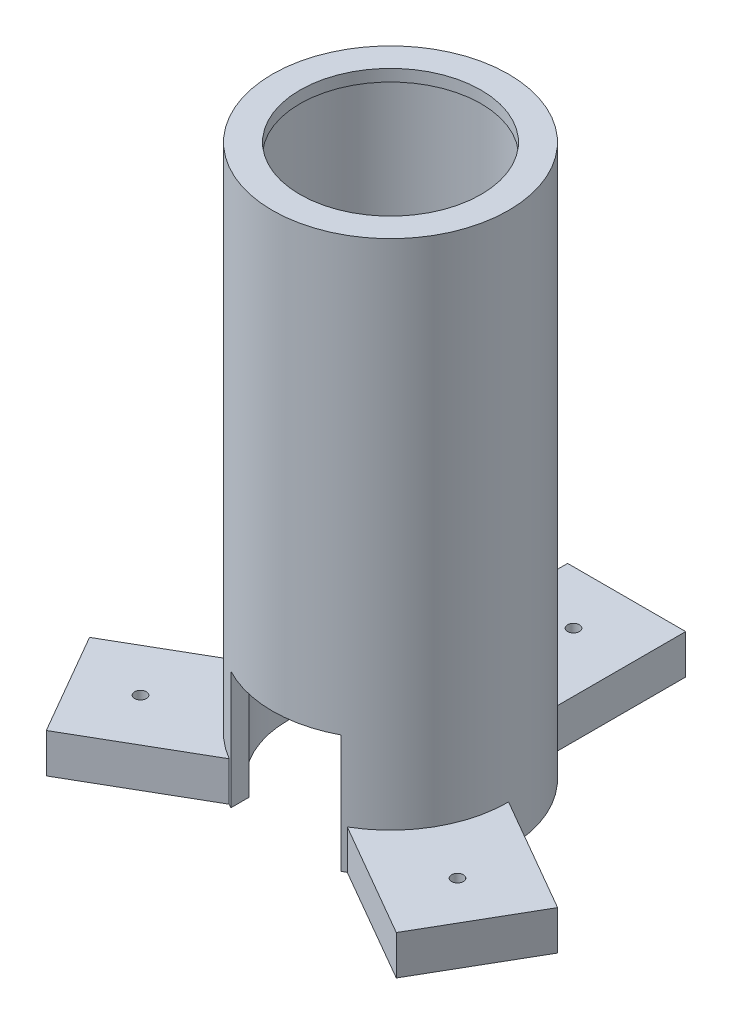
ISO-10303-21;
HEADER;
FILE_DESCRIPTION(('STEP AP214'),'2;1');
FILE_NAME('part.step','',(''),(''),'','','');
FILE_SCHEMA(('AUTOMOTIVE_DESIGN { 1 0 10303 214 1 1 1 1 }'));
ENDSEC;
DATA;
#1=APPLICATION_CONTEXT('core data for automotive mechanical design processes');
#2=APPLICATION_PROTOCOL_DEFINITION('international standard','automotive_design',2000,#1);
#3=PRODUCT_CONTEXT('',#1,'mechanical');
#4=PRODUCT('Part','Part','',(#3));
#5=PRODUCT_RELATED_PRODUCT_CATEGORY('part','',(#4));
#6=PRODUCT_DEFINITION_FORMATION('','',#4);
#7=PRODUCT_DEFINITION_CONTEXT('part definition',#1,'design');
#8=PRODUCT_DEFINITION('design','',#6,#7);
#9=PRODUCT_DEFINITION_SHAPE('','',#8);
#10=(LENGTH_UNIT() NAMED_UNIT(*) SI_UNIT(.MILLI.,.METRE.));
#11=(NAMED_UNIT(*) PLANE_ANGLE_UNIT() SI_UNIT($,.RADIAN.));
#12=(NAMED_UNIT(*) SI_UNIT($,.STERADIAN.) SOLID_ANGLE_UNIT());
#13=UNCERTAINTY_MEASURE_WITH_UNIT(LENGTH_MEASURE(1.E-05),#10,'distance_accuracy_value','');
#14=(GEOMETRIC_REPRESENTATION_CONTEXT(3) GLOBAL_UNCERTAINTY_ASSIGNED_CONTEXT((#13)) GLOBAL_UNIT_ASSIGNED_CONTEXT((#10,
#11,#12)) REPRESENTATION_CONTEXT('',''));
#15=CARTESIAN_POINT('',(0.,0.,0.));
#16=DIRECTION('',(0.,0.,1.));
#17=DIRECTION('',(1.,0.,0.));
#18=AXIS2_PLACEMENT_3D('',#15,#16,#17);
#19=CARTESIAN_POINT('',(0.,0.,0.));
#20=DIRECTION('',(0.,1.,0.));
#21=DIRECTION('',(0.,0.,1.));
#22=AXIS2_PLACEMENT_3D('',#19,#20,#21);
#23=PLANE('',#22);
#24=CARTESIAN_POINT('',(0.,0.,0.));
#25=DIRECTION('',(0.,1.,0.));
#26=DIRECTION('',(0.,0.,1.));
#27=AXIS2_PLACEMENT_3D('',#24,#25,#26);
#28=CIRCLE('',#27,13.);
#29=CARTESIAN_POINT('',(7.,0.,10.9544511501033));
#30=VERTEX_POINT('',#29);
#31=CARTESIAN_POINT('',(-7.,0.,10.9544511501033));
#32=VERTEX_POINT('',#31);
#33=EDGE_CURVE('E338',#30,#32,#28,.T.);
#34=ORIENTED_EDGE('',*,*,#33,.T.);
#35=DIRECTION('',(0.,0.,-1.));
#36=VECTOR('',#35,1.);
#37=CARTESIAN_POINT('',(-7.,0.,0.));
#38=LINE('',#37,#36);
#39=CARTESIAN_POINT('',(-7.,0.,13.2664991614216));
#40=VERTEX_POINT('',#39);
#41=EDGE_CURVE('E288',#40,#32,#38,.T.);
#42=ORIENTED_EDGE('',*,*,#41,.F.);
#43=CARTESIAN_POINT('',(0.,0.,0.));
#44=DIRECTION('',(0.,1.,0.));
#45=DIRECTION('',(0.,0.,1.));
#46=AXIS2_PLACEMENT_3D('',#43,#44,#45);
#47=CIRCLE('',#46,15.);
#48=CARTESIAN_POINT('',(-7.49999999999994,0.,12.9903810567666));
#49=VERTEX_POINT('',#48);
#50=EDGE_CURVE('E342',#49,#40,#47,.T.);
#51=ORIENTED_EDGE('',*,*,#50,.F.);
#52=DIRECTION('',(-0.866025403784436,0.,0.500000000000004));
#53=VECTOR('',#52,1.);
#54=CARTESIAN_POINT('',(-7.49999999999994,0.,12.9903810567666));
#55=LINE('',#54,#53);
#56=CARTESIAN_POINT('',(-22.2307621135331,0.,21.4951905283834));
#57=VERTEX_POINT('',#56);
#58=EDGE_CURVE('E229',#49,#57,#55,.T.);
#59=ORIENTED_EDGE('',*,*,#58,.T.);
#60=DIRECTION('',(-0.500000000000004,0.,-0.866025403784436));
#61=VECTOR('',#60,1.);
#62=CARTESIAN_POINT('',(-22.2307621135331,0.,21.4951905283834));
#63=LINE('',#62,#61);
#64=CARTESIAN_POINT('',(-29.7307621135331,0.,8.50480947161685));
#65=VERTEX_POINT('',#64);
#66=EDGE_CURVE('E214',#57,#65,#63,.T.);
#67=ORIENTED_EDGE('',*,*,#66,.T.);
#68=DIRECTION('',(0.866025403784437,0.,-0.500000000000004));
#69=VECTOR('',#68,1.);
#70=CARTESIAN_POINT('',(-15.,0.,0.));
#71=LINE('',#70,#69);
#72=CARTESIAN_POINT('',(-15.,0.,0.));
#73=VERTEX_POINT('',#72);
#74=EDGE_CURVE('E205',#65,#73,#71,.T.);
#75=ORIENTED_EDGE('',*,*,#74,.T.);
#76=CARTESIAN_POINT('',(-7.5,0.,-12.9903810567666));
#77=VERTEX_POINT('',#76);
#78=EDGE_CURVE('E348',#77,#73,#47,.T.);
#79=ORIENTED_EDGE('',*,*,#78,.F.);
#80=DIRECTION('',(0.,0.,-1.));
#81=VECTOR('',#80,1.);
#82=CARTESIAN_POINT('',(-7.5,0.,-12.9903810567666));
#83=LINE('',#82,#81);
#84=CARTESIAN_POINT('',(-7.5,0.,-30.));
#85=VERTEX_POINT('',#84);
#86=EDGE_CURVE('E278',#77,#85,#83,.T.);
#87=ORIENTED_EDGE('',*,*,#86,.T.);
#88=DIRECTION('',(1.,0.,0.));
#89=VECTOR('',#88,1.);
#90=CARTESIAN_POINT('',(-7.5,0.,-30.));
#91=LINE('',#90,#89);
#92=CARTESIAN_POINT('',(7.5,0.,-30.));
#93=VERTEX_POINT('',#92);
#94=EDGE_CURVE('E263',#85,#93,#91,.T.);
#95=ORIENTED_EDGE('',*,*,#94,.T.);
#96=DIRECTION('',(0.,0.,1.));
#97=VECTOR('',#96,1.);
#98=CARTESIAN_POINT('',(7.5,0.,-12.9903810567666));
#99=LINE('',#98,#97);
#100=CARTESIAN_POINT('',(7.5,0.,-12.9903810567666));
#101=VERTEX_POINT('',#100);
#102=EDGE_CURVE('E254',#93,#101,#99,.T.);
#103=ORIENTED_EDGE('',*,*,#102,.T.);
#104=CARTESIAN_POINT('',(15.,0.,-1.38777878078145E-13));
#105=VERTEX_POINT('',#104);
#106=EDGE_CURVE('E347',#105,#101,#47,.T.);
#107=ORIENTED_EDGE('',*,*,#106,.F.);
#108=DIRECTION('',(0.866025403784443,0.,0.499999999999992));
#109=VECTOR('',#108,1.);
#110=CARTESIAN_POINT('',(15.,0.,-1.38777878078145E-13));
#111=LINE('',#110,#109);
#112=CARTESIAN_POINT('',(29.7307621135332,0.,8.50480947161643));
#113=VERTEX_POINT('',#112);
#114=EDGE_CURVE('E190',#105,#113,#111,.T.);
#115=ORIENTED_EDGE('',*,*,#114,.T.);
#116=DIRECTION('',(-0.499999999999992,0.,0.866025403784443));
#117=VECTOR('',#116,1.);
#118=CARTESIAN_POINT('',(29.7307621135332,0.,8.50480947161643));
#119=LINE('',#118,#117);
#120=CARTESIAN_POINT('',(22.2307621135334,0.,21.4951905283831));
#121=VERTEX_POINT('',#120);
#122=EDGE_CURVE('E162',#113,#121,#119,.T.);
#123=ORIENTED_EDGE('',*,*,#122,.T.);
#124=DIRECTION('',(-0.866025403784443,0.,-0.499999999999992));
#125=VECTOR('',#124,1.);
#126=CARTESIAN_POINT('',(7.50000000000012,0.,12.9903810567665));
#127=LINE('',#126,#125);
#128=CARTESIAN_POINT('',(7.50000000000012,0.,12.9903810567665));
#129=VERTEX_POINT('',#128);
#130=EDGE_CURVE('E186',#121,#129,#127,.T.);
#131=ORIENTED_EDGE('',*,*,#130,.T.);
#132=CARTESIAN_POINT('',(7.,0.,13.2664991614216));
#133=VERTEX_POINT('',#132);
#134=EDGE_CURVE('E343',#133,#129,#47,.T.);
#135=ORIENTED_EDGE('',*,*,#134,.F.);
#136=DIRECTION('',(0.,0.,1.));
#137=VECTOR('',#136,1.);
#138=CARTESIAN_POINT('',(7.,0.,0.));
#139=LINE('',#138,#137);
#140=EDGE_CURVE('E303',#30,#133,#139,.T.);
#141=ORIENTED_EDGE('',*,*,#140,.F.);
#142=EDGE_LOOP('',(#34,#42,#51,#59,#67,#75,#79,#87,#95,#103,#107,#115,#123,#131,#135,#141));
#143=FACE_BOUND('',#142,.T.);
#144=CARTESIAN_POINT('',(0.,0.,-23.25));
#145=DIRECTION('',(0.,-1.,0.));
#146=DIRECTION('',(0.,0.,-1.));
#147=AXIS2_PLACEMENT_3D('',#144,#145,#146);
#148=CIRCLE('',#147,0.75);
#149=CARTESIAN_POINT('',(0.,0.,-24.));
#150=VERTEX_POINT('',#149);
#151=EDGE_CURVE('E239',#150,#150,#148,.T.);
#152=ORIENTED_EDGE('',*,*,#151,.F.);
#153=EDGE_LOOP('',(#152));
#154=FACE_BOUND('',#153,.T.);
#155=CARTESIAN_POINT('',(-20.1350906379881,0.,11.6250000000001));
#156=DIRECTION('',(0.,-1.,0.));
#157=DIRECTION('',(-0.866025403784436,0.,0.500000000000004));
#158=AXIS2_PLACEMENT_3D('',#155,#156,#157);
#159=CIRCLE('',#158,0.75);
#160=CARTESIAN_POINT('',(-20.7846096908265,0.,12.0000000000001));
#161=VERTEX_POINT('',#160);
#162=EDGE_CURVE('E197',#161,#161,#159,.T.);
#163=ORIENTED_EDGE('',*,*,#162,.F.);
#164=EDGE_LOOP('',(#163));
#165=FACE_BOUND('',#164,.T.);
#166=CARTESIAN_POINT('',(20.1350906379883,0.,11.6249999999998));
#167=DIRECTION('',(0.,-1.,0.));
#168=DIRECTION('',(0.866025403784443,0.,0.499999999999992));
#169=AXIS2_PLACEMENT_3D('',#166,#167,#168);
#170=CIRCLE('',#169,0.75);
#171=CARTESIAN_POINT('',(20.7846096908266,0.,11.9999999999998));
#172=VERTEX_POINT('',#171);
#173=EDGE_CURVE('E669',#172,#172,#170,.T.);
#174=ORIENTED_EDGE('',*,*,#173,.F.);
#175=EDGE_LOOP('',(#174));
#176=FACE_BOUND('',#175,.T.);
#177=ADVANCED_FACE('F43',(#143,#154,#165,#176),#23,.F.);
#178=CARTESIAN_POINT('',(0.,68.58,0.));
#179=DIRECTION('',(0.,-1.,0.));
#180=DIRECTION('',(0.,0.,-1.));
#181=AXIS2_PLACEMENT_3D('',#178,#179,#180);
#182=CYLINDRICAL_SURFACE('',#181,15.);
#183=ORIENTED_EDGE('',*,*,#134,.T.);
#184=DIRECTION('',(0.,-1.,0.));
#185=VECTOR('',#184,1.);
#186=CARTESIAN_POINT('',(7.50000000000013,5.,12.9903810567665));
#187=LINE('',#186,#185);
#188=CARTESIAN_POINT('',(7.50000000000012,5.,12.9903810567665));
#189=VERTEX_POINT('',#188);
#190=EDGE_CURVE('E59',#189,#129,#187,.T.);
#191=ORIENTED_EDGE('',*,*,#190,.F.);
#192=CARTESIAN_POINT('',(0.,5.,0.));
#193=DIRECTION('',(0.,1.,0.));
#194=DIRECTION('',(0.866025403784443,0.,0.499999999999992));
#195=AXIS2_PLACEMENT_3D('',#192,#193,#194);
#196=CIRCLE('',#195,15.);
#197=CARTESIAN_POINT('',(15.,5.,-1.38777878078145E-13));
#198=VERTEX_POINT('',#197);
#199=EDGE_CURVE('E63',#189,#198,#196,.T.);
#200=ORIENTED_EDGE('',*,*,#199,.T.);
#201=DIRECTION('',(0.,-1.,0.));
#202=VECTOR('',#201,1.);
#203=CARTESIAN_POINT('',(15.,5.,-1.38777878078145E-13));
#204=LINE('',#203,#202);
#205=EDGE_CURVE('E168',#198,#105,#204,.T.);
#206=ORIENTED_EDGE('',*,*,#205,.T.);
#207=ORIENTED_EDGE('',*,*,#106,.T.);
#208=DIRECTION('',(0.,-1.,0.));
#209=VECTOR('',#208,1.);
#210=CARTESIAN_POINT('',(7.49999999999999,5.,-12.9903810567666));
#211=LINE('',#210,#209);
#212=CARTESIAN_POINT('',(7.5,5.,-12.9903810567666));
#213=VERTEX_POINT('',#212);
#214=EDGE_CURVE('E274',#213,#101,#211,.T.);
#215=ORIENTED_EDGE('',*,*,#214,.F.);
#216=CARTESIAN_POINT('',(0.,5.,0.));
#217=DIRECTION('',(0.,1.,0.));
#218=DIRECTION('',(0.,0.,-1.));
#219=AXIS2_PLACEMENT_3D('',#216,#217,#218);
#220=CIRCLE('',#219,15.);
#221=CARTESIAN_POINT('',(-7.5,5.,-12.9903810567666));
#222=VERTEX_POINT('',#221);
#223=EDGE_CURVE('E262',#213,#222,#220,.T.);
#224=ORIENTED_EDGE('',*,*,#223,.T.);
#225=DIRECTION('',(0.,-1.,0.));
#226=VECTOR('',#225,1.);
#227=CARTESIAN_POINT('',(-7.5,5.,-12.9903810567666));
#228=LINE('',#227,#226);
#229=EDGE_CURVE('E292',#222,#77,#228,.T.);
#230=ORIENTED_EDGE('',*,*,#229,.T.);
#231=ORIENTED_EDGE('',*,*,#78,.T.);
#232=DIRECTION('',(0.,-1.,0.));
#233=VECTOR('',#232,1.);
#234=CARTESIAN_POINT('',(-15.,5.,0.));
#235=LINE('',#234,#233);
#236=CARTESIAN_POINT('',(-15.,5.,0.));
#237=VERTEX_POINT('',#236);
#238=EDGE_CURVE('E225',#237,#73,#235,.T.);
#239=ORIENTED_EDGE('',*,*,#238,.F.);
#240=CARTESIAN_POINT('',(0.,5.,0.));
#241=DIRECTION('',(0.,1.,0.));
#242=DIRECTION('',(-0.866025403784436,0.,0.500000000000004));
#243=AXIS2_PLACEMENT_3D('',#240,#241,#242);
#244=CIRCLE('',#243,15.);
#245=CARTESIAN_POINT('',(-7.49999999999994,5.,12.9903810567666));
#246=VERTEX_POINT('',#245);
#247=EDGE_CURVE('E213',#237,#246,#244,.T.);
#248=ORIENTED_EDGE('',*,*,#247,.T.);
#249=DIRECTION('',(0.,-1.,0.));
#250=VECTOR('',#249,1.);
#251=CARTESIAN_POINT('',(-7.49999999999994,5.,12.9903810567666));
#252=LINE('',#251,#250);
#253=EDGE_CURVE('E243',#246,#49,#252,.T.);
#254=ORIENTED_EDGE('',*,*,#253,.T.);
#255=ORIENTED_EDGE('',*,*,#50,.T.);
#256=DIRECTION('',(0.,-1.,0.));
#257=VECTOR('',#256,1.);
#258=CARTESIAN_POINT('',(-7.,68.58,13.2664991614216));
#259=LINE('',#258,#257);
#260=CARTESIAN_POINT('',(-7.,15.,13.2664991614216));
#261=VERTEX_POINT('',#260);
#262=EDGE_CURVE('E318',#40,#261,#259,.F.);
#263=ORIENTED_EDGE('',*,*,#262,.T.);
#264=CARTESIAN_POINT('',(0.,15.,0.));
#265=DIRECTION('',(0.,-1.,0.));
#266=DIRECTION('',(0.,0.,-1.));
#267=AXIS2_PLACEMENT_3D('',#264,#265,#266);
#268=CIRCLE('',#267,15.);
#269=CARTESIAN_POINT('',(7.,15.,13.2664991614216));
#270=VERTEX_POINT('',#269);
#271=EDGE_CURVE('E307',#270,#261,#268,.T.);
#272=ORIENTED_EDGE('',*,*,#271,.F.);
#273=DIRECTION('',(0.,-1.,0.));
#274=VECTOR('',#273,1.);
#275=CARTESIAN_POINT('',(7.,68.58,13.2664991614216));
#276=LINE('',#275,#274);
#277=EDGE_CURVE('E314',#270,#133,#276,.T.);
#278=ORIENTED_EDGE('',*,*,#277,.T.);
#279=EDGE_LOOP('',(#183,#191,#200,#206,#207,#215,#224,#230,#231,#239,#248,#254,#255,#263,#272,#278));
#280=FACE_BOUND('',#279,.T.);
#281=CARTESIAN_POINT('',(0.,70.08,0.));
#282=DIRECTION('',(0.,1.,0.));
#283=DIRECTION('',(0.,0.,1.));
#284=AXIS2_PLACEMENT_3D('',#281,#282,#283);
#285=CIRCLE('',#284,15.);
#286=CARTESIAN_POINT('',(0.,70.08,15.));
#287=VERTEX_POINT('',#286);
#288=EDGE_CURVE('E327',#287,#287,#285,.T.);
#289=ORIENTED_EDGE('',*,*,#288,.F.);
#290=EDGE_LOOP('',(#289));
#291=FACE_BOUND('',#290,.T.);
#292=ADVANCED_FACE('F45',(#280,#291),#182,.T.);
#293=CARTESIAN_POINT('',(0.,68.58,0.));
#294=DIRECTION('',(0.,-1.,0.));
#295=DIRECTION('',(0.,0.,-1.));
#296=AXIS2_PLACEMENT_3D('',#293,#294,#295);
#297=CYLINDRICAL_SURFACE('',#296,13.);
#298=DIRECTION('',(0.,-1.,0.));
#299=VECTOR('',#298,1.);
#300=CARTESIAN_POINT('',(-7.,68.58,10.9544511501033));
#301=LINE('',#300,#299);
#302=CARTESIAN_POINT('',(-7.,15.,10.9544511501033));
#303=VERTEX_POINT('',#302);
#304=EDGE_CURVE('E11',#32,#303,#301,.F.);
#305=ORIENTED_EDGE('',*,*,#304,.F.);
#306=ORIENTED_EDGE('',*,*,#33,.F.);
#307=DIRECTION('',(0.,-1.,0.));
#308=VECTOR('',#307,1.);
#309=CARTESIAN_POINT('',(7.,68.58,10.9544511501033));
#310=LINE('',#309,#308);
#311=CARTESIAN_POINT('',(7.,15.,10.9544511501033));
#312=VERTEX_POINT('',#311);
#313=EDGE_CURVE('E52',#312,#30,#310,.T.);
#314=ORIENTED_EDGE('',*,*,#313,.F.);
#315=CARTESIAN_POINT('',(0.,15.,0.));
#316=DIRECTION('',(0.,-1.,0.));
#317=DIRECTION('',(0.,0.,-1.));
#318=AXIS2_PLACEMENT_3D('',#315,#316,#317);
#319=CIRCLE('',#318,13.);
#320=EDGE_CURVE('E346',#312,#303,#319,.T.);
#321=ORIENTED_EDGE('',*,*,#320,.T.);
#322=EDGE_LOOP('',(#305,#306,#314,#321));
#323=FACE_BOUND('',#322,.T.);
#324=CARTESIAN_POINT('',(0.,68.58,0.));
#325=DIRECTION('',(0.,1.,0.));
#326=DIRECTION('',(0.,0.,1.));
#327=AXIS2_PLACEMENT_3D('',#324,#325,#326);
#328=CIRCLE('',#327,13.);
#329=CARTESIAN_POINT('',(0.,68.58,13.));
#330=VERTEX_POINT('',#329);
#331=EDGE_CURVE('E334',#330,#330,#328,.T.);
#332=ORIENTED_EDGE('',*,*,#331,.T.);
#333=EDGE_LOOP('',(#332));
#334=FACE_BOUND('',#333,.T.);
#335=ADVANCED_FACE('F364',(#323,#334),#297,.F.);
#336=CARTESIAN_POINT('',(0.,68.58,0.));
#337=DIRECTION('',(0.,1.,0.));
#338=DIRECTION('',(0.,0.,1.));
#339=AXIS2_PLACEMENT_3D('',#336,#337,#338);
#340=PLANE('',#339);
#341=CARTESIAN_POINT('',(0.,68.58,0.));
#342=DIRECTION('',(0.,1.,0.));
#343=DIRECTION('',(0.,0.,1.));
#344=AXIS2_PLACEMENT_3D('',#341,#342,#343);
#345=CIRCLE('',#344,11.5);
#346=CARTESIAN_POINT('',(0.,68.58,11.5));
#347=VERTEX_POINT('',#346);
#348=EDGE_CURVE('E322',#347,#347,#345,.T.);
#349=ORIENTED_EDGE('',*,*,#348,.T.);
#350=EDGE_LOOP('',(#349));
#351=FACE_BOUND('',#350,.T.);
#352=ORIENTED_EDGE('',*,*,#331,.F.);
#353=EDGE_LOOP('',(#352));
#354=FACE_BOUND('',#353,.T.);
#355=ADVANCED_FACE('F408',(#351,#354),#340,.F.);
#356=CARTESIAN_POINT('',(0.,70.08,0.));
#357=DIRECTION('',(0.,1.,0.));
#358=DIRECTION('',(0.,0.,1.));
#359=AXIS2_PLACEMENT_3D('',#356,#357,#358);
#360=PLANE('',#359);
#361=ORIENTED_EDGE('',*,*,#288,.T.);
#362=EDGE_LOOP('',(#361));
#363=FACE_BOUND('',#362,.T.);
#364=CARTESIAN_POINT('',(0.,70.08,0.));
#365=DIRECTION('',(0.,1.,0.));
#366=DIRECTION('',(0.,0.,1.));
#367=AXIS2_PLACEMENT_3D('',#364,#365,#366);
#368=CIRCLE('',#367,11.5);
#369=CARTESIAN_POINT('',(0.,70.08,11.5));
#370=VERTEX_POINT('',#369);
#371=EDGE_CURVE('E323',#370,#370,#368,.T.);
#372=ORIENTED_EDGE('',*,*,#371,.F.);
#373=EDGE_LOOP('',(#372));
#374=FACE_BOUND('',#373,.T.);
#375=ADVANCED_FACE('F411',(#363,#374),#360,.T.);
#376=CARTESIAN_POINT('',(0.,70.08,0.));
#377=DIRECTION('',(0.,-1.,0.));
#378=DIRECTION('',(0.,0.,-1.));
#379=AXIS2_PLACEMENT_3D('',#376,#377,#378);
#380=CYLINDRICAL_SURFACE('',#379,11.5);
#381=ORIENTED_EDGE('',*,*,#371,.T.);
#382=EDGE_LOOP('',(#381));
#383=FACE_BOUND('',#382,.T.);
#384=ORIENTED_EDGE('',*,*,#348,.F.);
#385=EDGE_LOOP('',(#384));
#386=FACE_BOUND('',#385,.T.);
#387=ADVANCED_FACE('F415',(#383,#386),#380,.F.);
#388=CARTESIAN_POINT('',(-7.,15.,0.));
#389=DIRECTION('',(-1.,0.,0.));
#390=DIRECTION('',(0.,0.,1.));
#391=AXIS2_PLACEMENT_3D('',#388,#389,#390);
#392=PLANE('',#391);
#393=ORIENTED_EDGE('',*,*,#41,.T.);
#394=ORIENTED_EDGE('',*,*,#304,.T.);
#395=DIRECTION('',(0.,0.,-1.));
#396=VECTOR('',#395,1.);
#397=CARTESIAN_POINT('',(-7.,15.,0.));
#398=LINE('',#397,#396);
#399=EDGE_CURVE('E299',#261,#303,#398,.T.);
#400=ORIENTED_EDGE('',*,*,#399,.F.);
#401=ORIENTED_EDGE('',*,*,#262,.F.);
#402=EDGE_LOOP('',(#393,#394,#400,#401));
#403=FACE_BOUND('',#402,.T.);
#404=ADVANCED_FACE('F368',(#403),#392,.F.);
#405=CARTESIAN_POINT('',(7.,15.,0.));
#406=DIRECTION('',(1.,0.,0.));
#407=DIRECTION('',(0.,0.,-1.));
#408=AXIS2_PLACEMENT_3D('',#405,#406,#407);
#409=PLANE('',#408);
#410=DIRECTION('',(0.,0.,1.));
#411=VECTOR('',#410,1.);
#412=CARTESIAN_POINT('',(7.,15.,0.));
#413=LINE('',#412,#411);
#414=EDGE_CURVE('E302',#312,#270,#413,.T.);
#415=ORIENTED_EDGE('',*,*,#414,.F.);
#416=ORIENTED_EDGE('',*,*,#313,.T.);
#417=ORIENTED_EDGE('',*,*,#140,.T.);
#418=ORIENTED_EDGE('',*,*,#277,.F.);
#419=EDGE_LOOP('',(#415,#416,#417,#418));
#420=FACE_BOUND('',#419,.T.);
#421=ADVANCED_FACE('F356',(#420),#409,.F.);
#422=CARTESIAN_POINT('',(0.,15.,0.));
#423=DIRECTION('',(0.,-1.,0.));
#424=DIRECTION('',(0.,0.,-1.));
#425=AXIS2_PLACEMENT_3D('',#422,#423,#424);
#426=PLANE('',#425);
#427=ORIENTED_EDGE('',*,*,#271,.T.);
#428=ORIENTED_EDGE('',*,*,#399,.T.);
#429=ORIENTED_EDGE('',*,*,#320,.F.);
#430=ORIENTED_EDGE('',*,*,#414,.T.);
#431=EDGE_LOOP('',(#427,#428,#429,#430));
#432=FACE_BOUND('',#431,.T.);
#433=ADVANCED_FACE('F424',(#432),#426,.T.);
#434=CARTESIAN_POINT('',(7.5,5.,-12.9903810567666));
#435=DIRECTION('',(1.,0.,0.));
#436=DIRECTION('',(0.,0.,-1.));
#437=AXIS2_PLACEMENT_3D('',#434,#435,#436);
#438=PLANE('',#437);
#439=ORIENTED_EDGE('',*,*,#102,.F.);
#440=DIRECTION('',(0.,-1.,0.));
#441=VECTOR('',#440,1.);
#442=CARTESIAN_POINT('',(7.5,5.,-30.));
#443=LINE('',#442,#441);
#444=CARTESIAN_POINT('',(7.5,5.,-30.));
#445=VERTEX_POINT('',#444);
#446=EDGE_CURVE('E285',#445,#93,#443,.T.);
#447=ORIENTED_EDGE('',*,*,#446,.F.);
#448=DIRECTION('',(0.,0.,1.));
#449=VECTOR('',#448,1.);
#450=CARTESIAN_POINT('',(7.5,5.,-12.9903810567666));
#451=LINE('',#450,#449);
#452=EDGE_CURVE('E258',#445,#213,#451,.T.);
#453=ORIENTED_EDGE('',*,*,#452,.T.);
#454=ORIENTED_EDGE('',*,*,#214,.T.);
#455=EDGE_LOOP('',(#439,#447,#453,#454));
#456=FACE_BOUND('',#455,.T.);
#457=ADVANCED_FACE('F427',(#456),#438,.T.);
#458=CARTESIAN_POINT('',(-7.5,5.,-30.));
#459=DIRECTION('',(0.,0.,-1.));
#460=DIRECTION('',(-1.,0.,0.));
#461=AXIS2_PLACEMENT_3D('',#458,#459,#460);
#462=PLANE('',#461);
#463=ORIENTED_EDGE('',*,*,#94,.F.);
#464=DIRECTION('',(0.,-1.,0.));
#465=VECTOR('',#464,1.);
#466=CARTESIAN_POINT('',(-7.5,5.,-30.));
#467=LINE('',#466,#465);
#468=CARTESIAN_POINT('',(-7.5,5.,-30.));
#469=VERTEX_POINT('',#468);
#470=EDGE_CURVE('E289',#469,#85,#467,.T.);
#471=ORIENTED_EDGE('',*,*,#470,.F.);
#472=DIRECTION('',(1.,0.,0.));
#473=VECTOR('',#472,1.);
#474=CARTESIAN_POINT('',(-7.5,5.,-30.));
#475=LINE('',#474,#473);
#476=EDGE_CURVE('E270',#469,#445,#475,.T.);
#477=ORIENTED_EDGE('',*,*,#476,.T.);
#478=ORIENTED_EDGE('',*,*,#446,.T.);
#479=EDGE_LOOP('',(#463,#471,#477,#478));
#480=FACE_BOUND('',#479,.T.);
#481=ADVANCED_FACE('F431',(#480),#462,.T.);
#482=CARTESIAN_POINT('',(-7.5,5.,-12.9903810567666));
#483=DIRECTION('',(-1.,0.,0.));
#484=DIRECTION('',(0.,0.,1.));
#485=AXIS2_PLACEMENT_3D('',#482,#483,#484);
#486=PLANE('',#485);
#487=ORIENTED_EDGE('',*,*,#86,.F.);
#488=ORIENTED_EDGE('',*,*,#229,.F.);
#489=DIRECTION('',(0.,0.,-1.));
#490=VECTOR('',#489,1.);
#491=CARTESIAN_POINT('',(-7.5,5.,-12.9903810567666));
#492=LINE('',#491,#490);
#493=EDGE_CURVE('E266',#222,#469,#492,.T.);
#494=ORIENTED_EDGE('',*,*,#493,.T.);
#495=ORIENTED_EDGE('',*,*,#470,.T.);
#496=EDGE_LOOP('',(#487,#488,#494,#495));
#497=FACE_BOUND('',#496,.T.);
#498=ADVANCED_FACE('F433',(#497),#486,.T.);
#499=CARTESIAN_POINT('',(0.,5.,0.));
#500=DIRECTION('',(0.,-1.,0.));
#501=DIRECTION('',(0.,0.,-1.));
#502=AXIS2_PLACEMENT_3D('',#499,#500,#501);
#503=PLANE('',#502);
#504=CARTESIAN_POINT('',(0.,5.,-23.25));
#505=DIRECTION('',(0.,-1.,0.));
#506=DIRECTION('',(0.,0.,-1.));
#507=AXIS2_PLACEMENT_3D('',#504,#505,#506);
#508=CIRCLE('',#507,0.75);
#509=CARTESIAN_POINT('',(0.,5.,-24.));
#510=VERTEX_POINT('',#509);
#511=EDGE_CURVE('E250',#510,#510,#508,.T.);
#512=ORIENTED_EDGE('',*,*,#511,.T.);
#513=EDGE_LOOP('',(#512));
#514=FACE_BOUND('',#513,.T.);
#515=ORIENTED_EDGE('',*,*,#452,.F.);
#516=ORIENTED_EDGE('',*,*,#476,.F.);
#517=ORIENTED_EDGE('',*,*,#493,.F.);
#518=ORIENTED_EDGE('',*,*,#223,.F.);
#519=EDGE_LOOP('',(#515,#516,#517,#518));
#520=FACE_BOUND('',#519,.T.);
#521=ADVANCED_FACE('F436',(#514,#520),#503,.F.);
#522=CARTESIAN_POINT('',(0.,5.,-23.25));
#523=DIRECTION('',(0.,-1.,0.));
#524=DIRECTION('',(0.,0.,-1.));
#525=AXIS2_PLACEMENT_3D('',#522,#523,#524);
#526=CYLINDRICAL_SURFACE('',#525,0.75);
#527=ORIENTED_EDGE('',*,*,#511,.F.);
#528=EDGE_LOOP('',(#527));
#529=FACE_BOUND('',#528,.T.);
#530=ORIENTED_EDGE('',*,*,#151,.T.);
#531=EDGE_LOOP('',(#530));
#532=FACE_BOUND('',#531,.T.);
#533=ADVANCED_FACE('F443',(#529,#532),#526,.F.);
#534=CARTESIAN_POINT('',(-15.,5.,0.));
#535=DIRECTION('',(-0.500000000000004,0.,-0.866025403784436));
#536=DIRECTION('',(-0.866025403784436,0.,0.500000000000004));
#537=AXIS2_PLACEMENT_3D('',#534,#535,#536);
#538=PLANE('',#537);
#539=ORIENTED_EDGE('',*,*,#74,.F.);
#540=DIRECTION('',(0.,-1.,0.));
#541=VECTOR('',#540,1.);
#542=CARTESIAN_POINT('',(-29.7307621135331,5.,8.50480947161685));
#543=LINE('',#542,#541);
#544=CARTESIAN_POINT('',(-29.7307621135331,5.,8.50480947161685));
#545=VERTEX_POINT('',#544);
#546=EDGE_CURVE('E236',#545,#65,#543,.T.);
#547=ORIENTED_EDGE('',*,*,#546,.F.);
#548=DIRECTION('',(0.866025403784437,0.,-0.500000000000004));
#549=VECTOR('',#548,1.);
#550=CARTESIAN_POINT('',(-15.,5.,0.));
#551=LINE('',#550,#549);
#552=EDGE_CURVE('E209',#545,#237,#551,.T.);
#553=ORIENTED_EDGE('',*,*,#552,.T.);
#554=ORIENTED_EDGE('',*,*,#238,.T.);
#555=EDGE_LOOP('',(#539,#547,#553,#554));
#556=FACE_BOUND('',#555,.T.);
#557=ADVANCED_FACE('F384',(#556),#538,.T.);
#558=CARTESIAN_POINT('',(-22.2307621135331,5.,21.4951905283834));
#559=DIRECTION('',(-0.866025403784436,0.,0.500000000000004));
#560=DIRECTION('',(0.500000000000004,0.,0.866025403784436));
#561=AXIS2_PLACEMENT_3D('',#558,#559,#560);
#562=PLANE('',#561);
#563=ORIENTED_EDGE('',*,*,#66,.F.);
#564=DIRECTION('',(0.,-1.,0.));
#565=VECTOR('',#564,1.);
#566=CARTESIAN_POINT('',(-22.2307621135331,5.,21.4951905283834));
#567=LINE('',#566,#565);
#568=CARTESIAN_POINT('',(-22.2307621135331,5.,21.4951905283834));
#569=VERTEX_POINT('',#568);
#570=EDGE_CURVE('E240',#569,#57,#567,.T.);
#571=ORIENTED_EDGE('',*,*,#570,.F.);
#572=DIRECTION('',(-0.500000000000004,0.,-0.866025403784436));
#573=VECTOR('',#572,1.);
#574=CARTESIAN_POINT('',(-22.2307621135331,5.,21.4951905283834));
#575=LINE('',#574,#573);
#576=EDGE_CURVE('E221',#569,#545,#575,.T.);
#577=ORIENTED_EDGE('',*,*,#576,.T.);
#578=ORIENTED_EDGE('',*,*,#546,.T.);
#579=EDGE_LOOP('',(#563,#571,#577,#578));
#580=FACE_BOUND('',#579,.T.);
#581=ADVANCED_FACE('F381',(#580),#562,.T.);
#582=CARTESIAN_POINT('',(-7.49999999999994,5.,12.9903810567666));
#583=DIRECTION('',(0.500000000000004,0.,0.866025403784436));
#584=DIRECTION('',(0.866025403784436,0.,-0.500000000000004));
#585=AXIS2_PLACEMENT_3D('',#582,#583,#584);
#586=PLANE('',#585);
#587=ORIENTED_EDGE('',*,*,#58,.F.);
#588=ORIENTED_EDGE('',*,*,#253,.F.);
#589=DIRECTION('',(-0.866025403784436,0.,0.500000000000004));
#590=VECTOR('',#589,1.);
#591=CARTESIAN_POINT('',(-7.49999999999994,5.,12.9903810567666));
#592=LINE('',#591,#590);
#593=EDGE_CURVE('E217',#246,#569,#592,.T.);
#594=ORIENTED_EDGE('',*,*,#593,.T.);
#595=ORIENTED_EDGE('',*,*,#570,.T.);
#596=EDGE_LOOP('',(#587,#588,#594,#595));
#597=FACE_BOUND('',#596,.T.);
#598=ADVANCED_FACE('F378',(#597),#586,.T.);
#599=CARTESIAN_POINT('',(0.,5.,0.));
#600=DIRECTION('',(0.,-1.,0.));
#601=DIRECTION('',(-0.866025403784436,0.,0.500000000000004));
#602=AXIS2_PLACEMENT_3D('',#599,#600,#601);
#603=PLANE('',#602);
#604=CARTESIAN_POINT('',(-20.1350906379881,5.,11.6250000000001));
#605=DIRECTION('',(0.,-1.,0.));
#606=DIRECTION('',(-0.866025403784436,0.,0.500000000000004));
#607=AXIS2_PLACEMENT_3D('',#604,#605,#606);
#608=CIRCLE('',#607,0.75);
#609=CARTESIAN_POINT('',(-20.7846096908265,5.,12.0000000000001));
#610=VERTEX_POINT('',#609);
#611=EDGE_CURVE('E201',#610,#610,#608,.T.);
#612=ORIENTED_EDGE('',*,*,#611,.T.);
#613=EDGE_LOOP('',(#612));
#614=FACE_BOUND('',#613,.T.);
#615=ORIENTED_EDGE('',*,*,#552,.F.);
#616=ORIENTED_EDGE('',*,*,#576,.F.);
#617=ORIENTED_EDGE('',*,*,#593,.F.);
#618=ORIENTED_EDGE('',*,*,#247,.F.);
#619=EDGE_LOOP('',(#615,#616,#617,#618));
#620=FACE_BOUND('',#619,.T.);
#621=ADVANCED_FACE('F387',(#614,#620),#603,.F.);
#622=CARTESIAN_POINT('',(-20.1350906379881,5.,11.6250000000001));
#623=DIRECTION('',(0.,-1.,0.));
#624=DIRECTION('',(0.,0.,-1.));
#625=AXIS2_PLACEMENT_3D('',#622,#623,#624);
#626=CYLINDRICAL_SURFACE('',#625,0.75);
#627=ORIENTED_EDGE('',*,*,#611,.F.);
#628=EDGE_LOOP('',(#627));
#629=FACE_BOUND('',#628,.T.);
#630=ORIENTED_EDGE('',*,*,#162,.T.);
#631=EDGE_LOOP('',(#630));
#632=FACE_BOUND('',#631,.T.);
#633=ADVANCED_FACE('F389',(#629,#632),#626,.F.);
#634=CARTESIAN_POINT('',(7.50000000000012,5.,12.9903810567665));
#635=DIRECTION('',(-0.499999999999992,0.,0.866025403784443));
#636=DIRECTION('',(0.866025403784443,0.,0.499999999999992));
#637=AXIS2_PLACEMENT_3D('',#634,#635,#636);
#638=PLANE('',#637);
#639=ORIENTED_EDGE('',*,*,#130,.F.);
#640=DIRECTION('',(0.,-1.,0.));
#641=VECTOR('',#640,1.);
#642=CARTESIAN_POINT('',(22.2307621135334,5.,21.4951905283831));
#643=LINE('',#642,#641);
#644=CARTESIAN_POINT('',(22.2307621135334,5.,21.4951905283831));
#645=VERTEX_POINT('',#644);
#646=EDGE_CURVE('E167',#645,#121,#643,.T.);
#647=ORIENTED_EDGE('',*,*,#646,.F.);
#648=DIRECTION('',(-0.866025403784443,0.,-0.499999999999992));
#649=VECTOR('',#648,1.);
#650=CARTESIAN_POINT('',(7.50000000000012,5.,12.9903810567665));
#651=LINE('',#650,#649);
#652=EDGE_CURVE('E179',#645,#189,#651,.T.);
#653=ORIENTED_EDGE('',*,*,#652,.T.);
#654=ORIENTED_EDGE('',*,*,#190,.T.);
#655=EDGE_LOOP('',(#639,#647,#653,#654));
#656=FACE_BOUND('',#655,.T.);
#657=ADVANCED_FACE('F396',(#656),#638,.T.);
#658=CARTESIAN_POINT('',(29.7307621135332,5.,8.50480947161643));
#659=DIRECTION('',(0.866025403784443,0.,0.499999999999992));
#660=DIRECTION('',(0.499999999999992,0.,-0.866025403784443));
#661=AXIS2_PLACEMENT_3D('',#658,#659,#660);
#662=PLANE('',#661);
#663=ORIENTED_EDGE('',*,*,#122,.F.);
#664=DIRECTION('',(0.,-1.,0.));
#665=VECTOR('',#664,1.);
#666=CARTESIAN_POINT('',(29.7307621135332,5.,8.50480947161643));
#667=LINE('',#666,#665);
#668=CARTESIAN_POINT('',(29.7307621135332,5.,8.50480947161643));
#669=VERTEX_POINT('',#668);
#670=EDGE_CURVE('E156',#669,#113,#667,.T.);
#671=ORIENTED_EDGE('',*,*,#670,.F.);
#672=DIRECTION('',(-0.499999999999992,0.,0.866025403784443));
#673=VECTOR('',#672,1.);
#674=CARTESIAN_POINT('',(29.7307621135332,5.,8.50480947161643));
#675=LINE('',#674,#673);
#676=EDGE_CURVE('E160',#669,#645,#675,.T.);
#677=ORIENTED_EDGE('',*,*,#676,.T.);
#678=ORIENTED_EDGE('',*,*,#646,.T.);
#679=EDGE_LOOP('',(#663,#671,#677,#678));
#680=FACE_BOUND('',#679,.T.);
#681=ADVANCED_FACE('F158',(#680),#662,.T.);
#682=CARTESIAN_POINT('',(15.,5.,-1.38777878078145E-13));
#683=DIRECTION('',(0.499999999999992,0.,-0.866025403784443));
#684=DIRECTION('',(-0.866025403784443,0.,-0.499999999999992));
#685=AXIS2_PLACEMENT_3D('',#682,#683,#684);
#686=PLANE('',#685);
#687=ORIENTED_EDGE('',*,*,#114,.F.);
#688=ORIENTED_EDGE('',*,*,#205,.F.);
#689=DIRECTION('',(0.866025403784443,0.,0.499999999999992));
#690=VECTOR('',#689,1.);
#691=CARTESIAN_POINT('',(15.,5.,-1.38777878078145E-13));
#692=LINE('',#691,#690);
#693=EDGE_CURVE('E171',#198,#669,#692,.T.);
#694=ORIENTED_EDGE('',*,*,#693,.T.);
#695=ORIENTED_EDGE('',*,*,#670,.T.);
#696=EDGE_LOOP('',(#687,#688,#694,#695));
#697=FACE_BOUND('',#696,.T.);
#698=ADVANCED_FACE('F172',(#697),#686,.T.);
#699=CARTESIAN_POINT('',(0.,5.,0.));
#700=DIRECTION('',(0.,-1.,0.));
#701=DIRECTION('',(0.866025403784443,0.,0.499999999999992));
#702=AXIS2_PLACEMENT_3D('',#699,#700,#701);
#703=PLANE('',#702);
#704=CARTESIAN_POINT('',(20.1350906379883,5.,11.6249999999998));
#705=DIRECTION('',(0.,-1.,0.));
#706=DIRECTION('',(0.866025403784443,0.,0.499999999999992));
#707=AXIS2_PLACEMENT_3D('',#704,#705,#706);
#708=CIRCLE('',#707,0.75);
#709=CARTESIAN_POINT('',(20.7846096908266,5.,11.9999999999998));
#710=VERTEX_POINT('',#709);
#711=EDGE_CURVE('E191',#710,#710,#708,.T.);
#712=ORIENTED_EDGE('',*,*,#711,.T.);
#713=EDGE_LOOP('',(#712));
#714=FACE_BOUND('',#713,.T.);
#715=ORIENTED_EDGE('',*,*,#652,.F.);
#716=ORIENTED_EDGE('',*,*,#676,.F.);
#717=ORIENTED_EDGE('',*,*,#693,.F.);
#718=ORIENTED_EDGE('',*,*,#199,.F.);
#719=EDGE_LOOP('',(#715,#716,#717,#718));
#720=FACE_BOUND('',#719,.T.);
#721=ADVANCED_FACE('F177',(#714,#720),#703,.F.);
#722=CARTESIAN_POINT('',(20.1350906379883,5.,11.6249999999998));
#723=DIRECTION('',(0.,-1.,0.));
#724=DIRECTION('',(0.,0.,-1.));
#725=AXIS2_PLACEMENT_3D('',#722,#723,#724);
#726=CYLINDRICAL_SURFACE('',#725,0.75);
#727=ORIENTED_EDGE('',*,*,#711,.F.);
#728=EDGE_LOOP('',(#727));
#729=FACE_BOUND('',#728,.T.);
#730=ORIENTED_EDGE('',*,*,#173,.T.);
#731=EDGE_LOOP('',(#730));
#732=FACE_BOUND('',#731,.T.);
#733=ADVANCED_FACE('F508',(#729,#732),#726,.F.);
#734=CLOSED_SHELL('',(#177,#292,#335,#355,#375,#387,#404,#421,#433,#457,#481,#498,#521,#533,
#557,#581,#598,#621,#633,#657,#681,#698,#721,#733));
#735=MANIFOLD_SOLID_BREP('B2',#734);
#736=ADVANCED_BREP_SHAPE_REPRESENTATION('',(#18,#735),#14);
#737=SHAPE_DEFINITION_REPRESENTATION(#9,#736);
ENDSEC;
END-ISO-10303-21;
